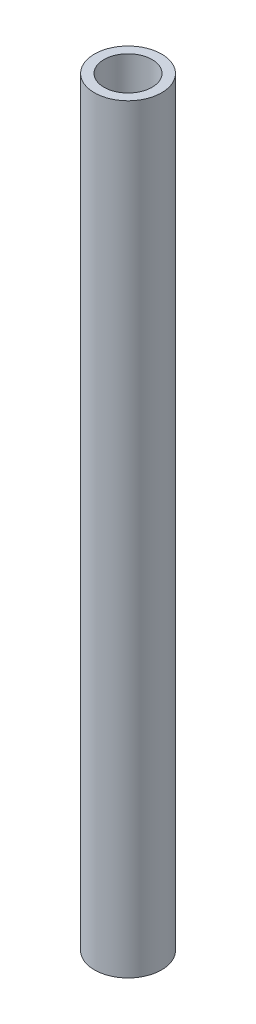
ISO-10303-21;
HEADER;
FILE_DESCRIPTION(('STEP AP214'),'2;1');
FILE_NAME('part.step','',(''),(''),'','','');
FILE_SCHEMA(('AUTOMOTIVE_DESIGN { 1 0 10303 214 1 1 1 1 }'));
ENDSEC;
DATA;
#1=APPLICATION_CONTEXT('core data for automotive mechanical design processes');
#2=APPLICATION_PROTOCOL_DEFINITION('international standard','automotive_design',2000,#1);
#3=PRODUCT_CONTEXT('',#1,'mechanical');
#4=PRODUCT('Part','Part','',(#3));
#5=PRODUCT_RELATED_PRODUCT_CATEGORY('part','',(#4));
#6=PRODUCT_DEFINITION_FORMATION('','',#4);
#7=PRODUCT_DEFINITION_CONTEXT('part definition',#1,'design');
#8=PRODUCT_DEFINITION('design','',#6,#7);
#9=PRODUCT_DEFINITION_SHAPE('','',#8);
#10=(LENGTH_UNIT() NAMED_UNIT(*) SI_UNIT(.MILLI.,.METRE.));
#11=(NAMED_UNIT(*) PLANE_ANGLE_UNIT() SI_UNIT($,.RADIAN.));
#12=(NAMED_UNIT(*) SI_UNIT($,.STERADIAN.) SOLID_ANGLE_UNIT());
#13=UNCERTAINTY_MEASURE_WITH_UNIT(LENGTH_MEASURE(1.E-05),#10,'distance_accuracy_value','');
#14=(GEOMETRIC_REPRESENTATION_CONTEXT(3) GLOBAL_UNCERTAINTY_ASSIGNED_CONTEXT((#13)) GLOBAL_UNIT_ASSIGNED_CONTEXT((#10,
#11,#12)) REPRESENTATION_CONTEXT('',''));
#15=CARTESIAN_POINT('',(0.,0.,0.));
#16=DIRECTION('',(0.,0.,1.));
#17=DIRECTION('',(1.,0.,0.));
#18=AXIS2_PLACEMENT_3D('',#15,#16,#17);
#19=CARTESIAN_POINT('',(0.,241.3,0.));
#20=DIRECTION('',(0.,1.,0.));
#21=DIRECTION('',(0.,0.,1.));
#22=AXIS2_PLACEMENT_3D('',#19,#20,#21);
#23=PLANE('',#22);
#24=CARTESIAN_POINT('',(0.,241.3,0.));
#25=DIRECTION('',(0.,1.,0.));
#26=DIRECTION('',(0.,0.,1.));
#27=AXIS2_PLACEMENT_3D('',#24,#25,#26);
#28=CIRCLE('',#27,10.668);
#29=CARTESIAN_POINT('',(0.,241.3,-10.668));
#30=VERTEX_POINT('',#29);
#31=EDGE_CURVE('E10',#30,#30,#28,.T.);
#32=ORIENTED_EDGE('',*,*,#31,.T.);
#33=EDGE_LOOP('',(#32));
#34=FACE_BOUND('',#33,.T.);
#35=CARTESIAN_POINT('',(0.,241.3,0.));
#36=DIRECTION('',(0.,1.,0.));
#37=DIRECTION('',(0.,0.,1.));
#38=AXIS2_PLACEMENT_3D('',#35,#36,#37);
#39=CIRCLE('',#38,7.6454);
#40=CARTESIAN_POINT('',(0.,241.3,-7.6454));
#41=VERTEX_POINT('',#40);
#42=EDGE_CURVE('E41',#41,#41,#39,.T.);
#43=ORIENTED_EDGE('',*,*,#42,.F.);
#44=EDGE_LOOP('',(#43));
#45=FACE_BOUND('',#44,.T.);
#46=ADVANCED_FACE('F30',(#34,#45),#23,.T.);
#47=CARTESIAN_POINT('',(0.,0.,0.));
#48=DIRECTION('',(0.,1.,0.));
#49=DIRECTION('',(0.,0.,1.));
#50=AXIS2_PLACEMENT_3D('',#47,#48,#49);
#51=PLANE('',#50);
#52=CARTESIAN_POINT('',(0.,0.,0.));
#53=DIRECTION('',(0.,1.,0.));
#54=DIRECTION('',(0.,0.,1.));
#55=AXIS2_PLACEMENT_3D('',#52,#53,#54);
#56=CIRCLE('',#55,10.668);
#57=CARTESIAN_POINT('',(0.,0.,-10.668));
#58=VERTEX_POINT('',#57);
#59=EDGE_CURVE('E34',#58,#58,#56,.T.);
#60=ORIENTED_EDGE('',*,*,#59,.F.);
#61=EDGE_LOOP('',(#60));
#62=FACE_BOUND('',#61,.T.);
#63=CARTESIAN_POINT('',(0.,0.,0.));
#64=DIRECTION('',(0.,1.,0.));
#65=DIRECTION('',(0.,0.,1.));
#66=AXIS2_PLACEMENT_3D('',#63,#64,#65);
#67=CIRCLE('',#66,7.6454);
#68=CARTESIAN_POINT('',(0.,0.,-7.6454));
#69=VERTEX_POINT('',#68);
#70=EDGE_CURVE('E43',#69,#69,#67,.T.);
#71=ORIENTED_EDGE('',*,*,#70,.T.);
#72=EDGE_LOOP('',(#71));
#73=FACE_BOUND('',#72,.T.);
#74=ADVANCED_FACE('F53',(#62,#73),#51,.F.);
#75=CARTESIAN_POINT('',(0.,241.3,0.));
#76=DIRECTION('',(0.,-1.,0.));
#77=DIRECTION('',(0.,0.,-1.));
#78=AXIS2_PLACEMENT_3D('',#75,#76,#77);
#79=CYLINDRICAL_SURFACE('',#78,10.668);
#80=CARTESIAN_POINT('',(0.,241.3,-10.668));
#81=CARTESIAN_POINT('',(0.,238.786458333333,-10.668));
#82=CARTESIAN_POINT('',(0.,236.272916666667,-10.668));
#83=CARTESIAN_POINT('',(0.,231.245833333333,-10.668));
#84=CARTESIAN_POINT('',(0.,228.732291666667,-10.668));
#85=CARTESIAN_POINT('',(0.,223.705208333333,-10.668));
#86=CARTESIAN_POINT('',(0.,221.191666666667,-10.668));
#87=CARTESIAN_POINT('',(0.,216.164583333333,-10.668));
#88=CARTESIAN_POINT('',(0.,213.651041666667,-10.668));
#89=CARTESIAN_POINT('',(0.,208.623958333333,-10.668));
#90=CARTESIAN_POINT('',(0.,206.110416666667,-10.668));
#91=CARTESIAN_POINT('',(0.,201.083333333333,-10.668));
#92=CARTESIAN_POINT('',(0.,198.569791666667,-10.668));
#93=CARTESIAN_POINT('',(0.,193.542708333333,-10.668));
#94=CARTESIAN_POINT('',(0.,191.029166666667,-10.668));
#95=CARTESIAN_POINT('',(0.,186.002083333333,-10.668));
#96=CARTESIAN_POINT('',(0.,183.488541666667,-10.668));
#97=CARTESIAN_POINT('',(0.,178.461458333333,-10.668));
#98=CARTESIAN_POINT('',(0.,175.947916666667,-10.668));
#99=CARTESIAN_POINT('',(0.,170.920833333333,-10.668));
#100=CARTESIAN_POINT('',(0.,168.407291666667,-10.668));
#101=CARTESIAN_POINT('',(0.,163.380208333333,-10.668));
#102=CARTESIAN_POINT('',(0.,160.866666666667,-10.668));
#103=CARTESIAN_POINT('',(0.,155.839583333333,-10.668));
#104=CARTESIAN_POINT('',(0.,153.326041666667,-10.668));
#105=CARTESIAN_POINT('',(0.,148.298958333333,-10.668));
#106=CARTESIAN_POINT('',(0.,145.785416666667,-10.668));
#107=CARTESIAN_POINT('',(0.,140.758333333333,-10.668));
#108=CARTESIAN_POINT('',(0.,138.244791666667,-10.668));
#109=CARTESIAN_POINT('',(0.,133.217708333333,-10.668));
#110=CARTESIAN_POINT('',(0.,130.704166666667,-10.668));
#111=CARTESIAN_POINT('',(0.,125.677083333333,-10.668));
#112=CARTESIAN_POINT('',(0.,123.163541666667,-10.668));
#113=CARTESIAN_POINT('',(0.,118.136458333333,-10.668));
#114=CARTESIAN_POINT('',(0.,115.622916666667,-10.668));
#115=CARTESIAN_POINT('',(0.,110.595833333333,-10.668));
#116=CARTESIAN_POINT('',(0.,108.082291666667,-10.668));
#117=CARTESIAN_POINT('',(0.,103.055208333333,-10.668));
#118=CARTESIAN_POINT('',(0.,100.541666666667,-10.668));
#119=CARTESIAN_POINT('',(0.,95.5145833333333,-10.668));
#120=CARTESIAN_POINT('',(0.,93.0010416666667,-10.668));
#121=CARTESIAN_POINT('',(0.,87.9739583333333,-10.668));
#122=CARTESIAN_POINT('',(0.,85.4604166666667,-10.668));
#123=CARTESIAN_POINT('',(0.,80.4333333333333,-10.668));
#124=CARTESIAN_POINT('',(0.,77.9197916666667,-10.668));
#125=CARTESIAN_POINT('',(0.,72.8927083333333,-10.668));
#126=CARTESIAN_POINT('',(0.,70.3791666666667,-10.668));
#127=CARTESIAN_POINT('',(0.,65.3520833333333,-10.668));
#128=CARTESIAN_POINT('',(0.,62.8385416666667,-10.668));
#129=CARTESIAN_POINT('',(0.,57.8114583333333,-10.668));
#130=CARTESIAN_POINT('',(0.,55.2979166666667,-10.668));
#131=CARTESIAN_POINT('',(0.,50.2708333333333,-10.668));
#132=CARTESIAN_POINT('',(0.,47.7572916666667,-10.668));
#133=CARTESIAN_POINT('',(0.,42.7302083333333,-10.668));
#134=CARTESIAN_POINT('',(0.,40.2166666666667,-10.668));
#135=CARTESIAN_POINT('',(0.,35.1895833333333,-10.668));
#136=CARTESIAN_POINT('',(0.,32.6760416666667,-10.668));
#137=CARTESIAN_POINT('',(0.,27.6489583333333,-10.668));
#138=CARTESIAN_POINT('',(0.,25.1354166666667,-10.668));
#139=CARTESIAN_POINT('',(0.,20.1083333333333,-10.668));
#140=CARTESIAN_POINT('',(0.,17.5947916666667,-10.668));
#141=CARTESIAN_POINT('',(0.,12.5677083333333,-10.668));
#142=CARTESIAN_POINT('',(0.,10.0541666666667,-10.668));
#143=CARTESIAN_POINT('',(0.,5.02708333333333,-10.668));
#144=CARTESIAN_POINT('',(0.,2.51354166666667,-10.668));
#145=CARTESIAN_POINT('',(0.,0.,-10.668));
#146=B_SPLINE_CURVE_WITH_KNOTS('',3,(#80,#81,#82,#83,#84,#85,#86,#87,#88,#89,#90,#91,#92,#93,
#94,#95,#96,#97,#98,#99,#100,#101,#102,#103,#104,#105,#106,#107,#108,#109,#110,#111,#112,#113,
#114,#115,#116,#117,#118,#119,#120,#121,#122,#123,#124,#125,#126,#127,#128,#129,#130,#131,#132,
#133,#134,#135,#136,#137,#138,#139,#140,#141,#142,#143,#144,#145),.UNSPECIFIED.,.F.,.F.,(4,2,2,
2,2,2,2,2,2,2,2,2,2,2,2,2,2,2,2,2,2,2,2,2,2,2,2,2,2,2,2,2,4),(0.,7.540625,15.08125,22.621875,
30.1625,37.703125,45.24375,52.784375,60.325,67.865625,75.40625,82.946875,90.4875,98.028125,
105.56875,113.109375,120.65,128.190625,135.73125,143.271875,150.8125,158.353125,165.89375,
173.434375,180.975,188.515625,196.05625,203.596875,211.1375,218.678125,226.21875,233.759375,
241.3),.UNSPECIFIED.);
#147=EDGE_CURVE('BSEAM32',#30,#58,#146,.T.);
#148=ORIENTED_EDGE('',*,*,#31,.F.);
#149=ORIENTED_EDGE('',*,*,#59,.T.);
#150=ORIENTED_EDGE('',*,*,#147,.T.);
#151=ORIENTED_EDGE('',*,*,#147,.F.);
#152=EDGE_LOOP('',(#148,#150,#149,#151));
#153=FACE_BOUND('',#152,.T.);
#154=ADVANCED_FACE('F32',(#153),#79,.T.);
#155=CARTESIAN_POINT('',(0.,241.3,0.));
#156=DIRECTION('',(0.,-1.,0.));
#157=DIRECTION('',(0.,0.,-1.));
#158=AXIS2_PLACEMENT_3D('',#155,#156,#157);
#159=CYLINDRICAL_SURFACE('',#158,7.6454);
#160=CARTESIAN_POINT('',(0.,241.3,-7.6454));
#161=CARTESIAN_POINT('',(0.,238.786458333333,-7.6454));
#162=CARTESIAN_POINT('',(0.,236.272916666667,-7.6454));
#163=CARTESIAN_POINT('',(0.,231.245833333333,-7.6454));
#164=CARTESIAN_POINT('',(0.,228.732291666667,-7.6454));
#165=CARTESIAN_POINT('',(0.,223.705208333333,-7.6454));
#166=CARTESIAN_POINT('',(0.,221.191666666667,-7.6454));
#167=CARTESIAN_POINT('',(0.,216.164583333333,-7.6454));
#168=CARTESIAN_POINT('',(0.,213.651041666667,-7.6454));
#169=CARTESIAN_POINT('',(0.,208.623958333333,-7.6454));
#170=CARTESIAN_POINT('',(0.,206.110416666667,-7.6454));
#171=CARTESIAN_POINT('',(0.,201.083333333333,-7.6454));
#172=CARTESIAN_POINT('',(0.,198.569791666667,-7.6454));
#173=CARTESIAN_POINT('',(0.,193.542708333333,-7.6454));
#174=CARTESIAN_POINT('',(0.,191.029166666667,-7.6454));
#175=CARTESIAN_POINT('',(0.,186.002083333333,-7.6454));
#176=CARTESIAN_POINT('',(0.,183.488541666667,-7.6454));
#177=CARTESIAN_POINT('',(0.,178.461458333333,-7.6454));
#178=CARTESIAN_POINT('',(0.,175.947916666667,-7.6454));
#179=CARTESIAN_POINT('',(0.,170.920833333333,-7.6454));
#180=CARTESIAN_POINT('',(0.,168.407291666667,-7.6454));
#181=CARTESIAN_POINT('',(0.,163.380208333333,-7.6454));
#182=CARTESIAN_POINT('',(0.,160.866666666667,-7.6454));
#183=CARTESIAN_POINT('',(0.,155.839583333333,-7.6454));
#184=CARTESIAN_POINT('',(0.,153.326041666667,-7.6454));
#185=CARTESIAN_POINT('',(0.,148.298958333333,-7.6454));
#186=CARTESIAN_POINT('',(0.,145.785416666667,-7.6454));
#187=CARTESIAN_POINT('',(0.,140.758333333333,-7.6454));
#188=CARTESIAN_POINT('',(0.,138.244791666667,-7.6454));
#189=CARTESIAN_POINT('',(0.,133.217708333333,-7.6454));
#190=CARTESIAN_POINT('',(0.,130.704166666667,-7.6454));
#191=CARTESIAN_POINT('',(0.,125.677083333333,-7.6454));
#192=CARTESIAN_POINT('',(0.,123.163541666667,-7.6454));
#193=CARTESIAN_POINT('',(0.,118.136458333333,-7.6454));
#194=CARTESIAN_POINT('',(0.,115.622916666667,-7.6454));
#195=CARTESIAN_POINT('',(0.,110.595833333333,-7.6454));
#196=CARTESIAN_POINT('',(0.,108.082291666667,-7.6454));
#197=CARTESIAN_POINT('',(0.,103.055208333333,-7.6454));
#198=CARTESIAN_POINT('',(0.,100.541666666667,-7.6454));
#199=CARTESIAN_POINT('',(0.,95.5145833333333,-7.6454));
#200=CARTESIAN_POINT('',(0.,93.0010416666667,-7.6454));
#201=CARTESIAN_POINT('',(0.,87.9739583333333,-7.6454));
#202=CARTESIAN_POINT('',(0.,85.4604166666667,-7.6454));
#203=CARTESIAN_POINT('',(0.,80.4333333333333,-7.6454));
#204=CARTESIAN_POINT('',(0.,77.9197916666667,-7.6454));
#205=CARTESIAN_POINT('',(0.,72.8927083333333,-7.6454));
#206=CARTESIAN_POINT('',(0.,70.3791666666667,-7.6454));
#207=CARTESIAN_POINT('',(0.,65.3520833333333,-7.6454));
#208=CARTESIAN_POINT('',(0.,62.8385416666667,-7.6454));
#209=CARTESIAN_POINT('',(0.,57.8114583333333,-7.6454));
#210=CARTESIAN_POINT('',(0.,55.2979166666667,-7.6454));
#211=CARTESIAN_POINT('',(0.,50.2708333333333,-7.6454));
#212=CARTESIAN_POINT('',(0.,47.7572916666667,-7.6454));
#213=CARTESIAN_POINT('',(0.,42.7302083333333,-7.6454));
#214=CARTESIAN_POINT('',(0.,40.2166666666667,-7.6454));
#215=CARTESIAN_POINT('',(0.,35.1895833333333,-7.6454));
#216=CARTESIAN_POINT('',(0.,32.6760416666667,-7.6454));
#217=CARTESIAN_POINT('',(0.,27.6489583333333,-7.6454));
#218=CARTESIAN_POINT('',(0.,25.1354166666667,-7.6454));
#219=CARTESIAN_POINT('',(0.,20.1083333333333,-7.6454));
#220=CARTESIAN_POINT('',(0.,17.5947916666667,-7.6454));
#221=CARTESIAN_POINT('',(0.,12.5677083333333,-7.6454));
#222=CARTESIAN_POINT('',(0.,10.0541666666667,-7.6454));
#223=CARTESIAN_POINT('',(0.,5.02708333333333,-7.6454));
#224=CARTESIAN_POINT('',(0.,2.51354166666667,-7.6454));
#225=CARTESIAN_POINT('',(0.,0.,-7.6454));
#226=B_SPLINE_CURVE_WITH_KNOTS('',3,(#160,#161,#162,#163,#164,#165,#166,#167,#168,#169,#170,
#171,#172,#173,#174,#175,#176,#177,#178,#179,#180,#181,#182,#183,#184,#185,#186,#187,#188,#189,
#190,#191,#192,#193,#194,#195,#196,#197,#198,#199,#200,#201,#202,#203,#204,#205,#206,#207,#208,
#209,#210,#211,#212,#213,#214,#215,#216,#217,#218,#219,#220,#221,#222,#223,#224,#225),
.UNSPECIFIED.,.F.,.F.,(4,2,2,2,2,2,2,2,2,2,2,2,2,2,2,2,2,2,2,2,2,2,2,2,2,2,2,2,2,2,2,2,4),(0.,
7.540625,15.08125,22.621875,30.1625,37.703125,45.24375,52.784375,60.325,67.865625,75.40625,
82.946875,90.4875,98.028125,105.56875,113.109375,120.65,128.190625,135.73125,143.271875,
150.8125,158.353125,165.89375,173.434375,180.975,188.515625,196.05625,203.596875,211.1375,
218.678125,226.21875,233.759375,241.3),.UNSPECIFIED.);
#227=EDGE_CURVE('BSEAM49',#41,#69,#226,.T.);
#228=ORIENTED_EDGE('',*,*,#42,.T.);
#229=ORIENTED_EDGE('',*,*,#70,.F.);
#230=ORIENTED_EDGE('',*,*,#227,.T.);
#231=ORIENTED_EDGE('',*,*,#227,.F.);
#232=EDGE_LOOP('',(#228,#230,#229,#231));
#233=FACE_BOUND('',#232,.T.);
#234=ADVANCED_FACE('F49',(#233),#159,.F.);
#235=CLOSED_SHELL('',(#46,#74,#154,#234));
#236=MANIFOLD_SOLID_BREP('B2',#235);
#237=ADVANCED_BREP_SHAPE_REPRESENTATION('',(#18,#236),#14);
#238=SHAPE_DEFINITION_REPRESENTATION(#9,#237);
ENDSEC;
END-ISO-10303-21;
